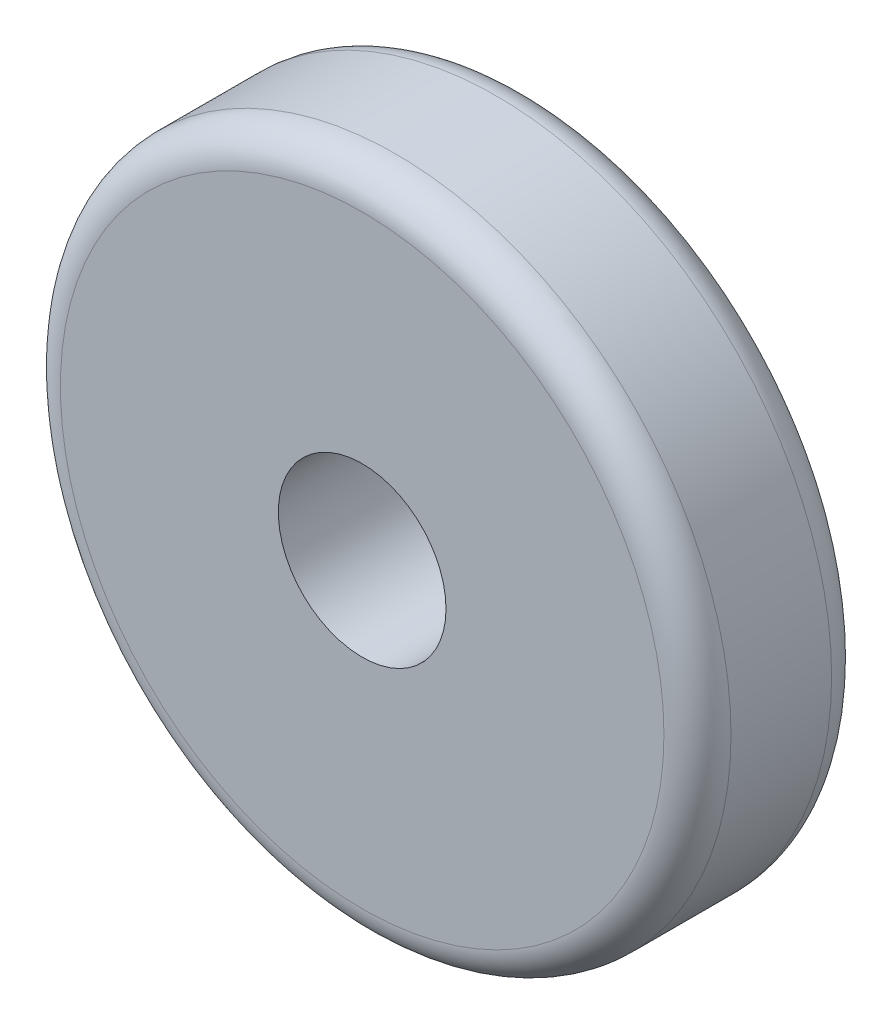
ISO-10303-21;
HEADER;
FILE_DESCRIPTION(('STEP AP214'),'2;1');
FILE_NAME('part.step','',(''),(''),'','','');
FILE_SCHEMA(('AUTOMOTIVE_DESIGN { 1 0 10303 214 1 1 1 1 }'));
ENDSEC;
DATA;
#1=APPLICATION_CONTEXT('core data for automotive mechanical design processes');
#2=APPLICATION_PROTOCOL_DEFINITION('international standard','automotive_design',2000,#1);
#3=PRODUCT_CONTEXT('',#1,'mechanical');
#4=PRODUCT('Part','Part','',(#3));
#5=PRODUCT_RELATED_PRODUCT_CATEGORY('part','',(#4));
#6=PRODUCT_DEFINITION_FORMATION('','',#4);
#7=PRODUCT_DEFINITION_CONTEXT('part definition',#1,'design');
#8=PRODUCT_DEFINITION('design','',#6,#7);
#9=PRODUCT_DEFINITION_SHAPE('','',#8);
#10=(LENGTH_UNIT() NAMED_UNIT(*) SI_UNIT(.MILLI.,.METRE.));
#11=(NAMED_UNIT(*) PLANE_ANGLE_UNIT() SI_UNIT($,.RADIAN.));
#12=(NAMED_UNIT(*) SI_UNIT($,.STERADIAN.) SOLID_ANGLE_UNIT());
#13=UNCERTAINTY_MEASURE_WITH_UNIT(LENGTH_MEASURE(1.E-05),#10,'distance_accuracy_value','');
#14=(GEOMETRIC_REPRESENTATION_CONTEXT(3) GLOBAL_UNCERTAINTY_ASSIGNED_CONTEXT((#13)) GLOBAL_UNIT_ASSIGNED_CONTEXT((#10,
#11,#12)) REPRESENTATION_CONTEXT('',''));
#15=CARTESIAN_POINT('',(0.,0.,0.));
#16=DIRECTION('',(0.,0.,1.));
#17=DIRECTION('',(1.,0.,0.));
#18=AXIS2_PLACEMENT_3D('',#15,#16,#17);
#19=CARTESIAN_POINT('',(0.,0.,5.));
#20=DIRECTION('',(0.,0.,-1.));
#21=DIRECTION('',(-1.,0.,0.));
#22=AXIS2_PLACEMENT_3D('',#19,#20,#21);
#23=CYLINDRICAL_SURFACE('',#22,20.);
#24=CARTESIAN_POINT('',(0.,0.,-3.));
#25=DIRECTION('',(0.,0.,1.));
#26=DIRECTION('',(1.,0.,0.));
#27=AXIS2_PLACEMENT_3D('',#24,#25,#26);
#28=CIRCLE('',#27,20.);
#29=CARTESIAN_POINT('',(20.,0.,-3.));
#30=VERTEX_POINT('',#29);
#31=EDGE_CURVE('E50',#30,#30,#28,.T.);
#32=ORIENTED_EDGE('',*,*,#31,.T.);
#33=EDGE_LOOP('',(#32));
#34=FACE_BOUND('',#33,.T.);
#35=CARTESIAN_POINT('',(0.,0.,3.));
#36=DIRECTION('',(0.,0.,1.));
#37=DIRECTION('',(1.,0.,0.));
#38=AXIS2_PLACEMENT_3D('',#35,#36,#37);
#39=CIRCLE('',#38,20.);
#40=CARTESIAN_POINT('',(20.,0.,3.));
#41=VERTEX_POINT('',#40);
#42=EDGE_CURVE('E55',#41,#41,#39,.F.);
#43=ORIENTED_EDGE('',*,*,#42,.T.);
#44=EDGE_LOOP('',(#43));
#45=FACE_BOUND('',#44,.T.);
#46=ADVANCED_FACE('F37',(#34,#45),#23,.T.);
#47=CARTESIAN_POINT('',(0.,0.,5.));
#48=DIRECTION('',(0.,0.,1.));
#49=DIRECTION('',(1.,0.,0.));
#50=AXIS2_PLACEMENT_3D('',#47,#48,#49);
#51=PLANE('',#50);
#52=CARTESIAN_POINT('',(0.,0.,5.));
#53=DIRECTION('',(0.,0.,1.));
#54=DIRECTION('',(1.,0.,0.));
#55=AXIS2_PLACEMENT_3D('',#52,#53,#54);
#56=CIRCLE('',#55,18.);
#57=CARTESIAN_POINT('',(18.,0.,5.));
#58=VERTEX_POINT('',#57);
#59=EDGE_CURVE('E10',#58,#58,#56,.T.);
#60=ORIENTED_EDGE('',*,*,#59,.T.);
#61=EDGE_LOOP('',(#60));
#62=FACE_BOUND('',#61,.T.);
#63=CARTESIAN_POINT('',(0.,0.,5.));
#64=DIRECTION('',(0.,0.,1.));
#65=DIRECTION('',(1.,0.,0.));
#66=AXIS2_PLACEMENT_3D('',#63,#64,#65);
#67=CIRCLE('',#66,5.);
#68=CARTESIAN_POINT('',(5.,0.,5.));
#69=VERTEX_POINT('',#68);
#70=EDGE_CURVE('E62',#69,#69,#67,.T.);
#71=ORIENTED_EDGE('',*,*,#70,.F.);
#72=EDGE_LOOP('',(#71));
#73=FACE_BOUND('',#72,.T.);
#74=ADVANCED_FACE('F79',(#62,#73),#51,.T.);
#75=CARTESIAN_POINT('',(0.,0.,-5.));
#76=DIRECTION('',(0.,0.,1.));
#77=DIRECTION('',(1.,0.,0.));
#78=AXIS2_PLACEMENT_3D('',#75,#76,#77);
#79=PLANE('',#78);
#80=CARTESIAN_POINT('',(0.,0.,-5.));
#81=DIRECTION('',(0.,0.,1.));
#82=DIRECTION('',(1.,0.,0.));
#83=AXIS2_PLACEMENT_3D('',#80,#81,#82);
#84=CIRCLE('',#83,18.);
#85=CARTESIAN_POINT('',(18.,0.,-5.));
#86=VERTEX_POINT('',#85);
#87=EDGE_CURVE('E45',#86,#86,#84,.F.);
#88=ORIENTED_EDGE('',*,*,#87,.T.);
#89=EDGE_LOOP('',(#88));
#90=FACE_BOUND('',#89,.T.);
#91=CARTESIAN_POINT('',(0.,0.,-5.));
#92=DIRECTION('',(0.,0.,1.));
#93=DIRECTION('',(1.,0.,0.));
#94=AXIS2_PLACEMENT_3D('',#91,#92,#93);
#95=CIRCLE('',#94,5.);
#96=CARTESIAN_POINT('',(5.,0.,-5.));
#97=VERTEX_POINT('',#96);
#98=EDGE_CURVE('E61',#97,#97,#95,.T.);
#99=ORIENTED_EDGE('',*,*,#98,.T.);
#100=EDGE_LOOP('',(#99));
#101=FACE_BOUND('',#100,.T.);
#102=ADVANCED_FACE('F70',(#90,#101),#79,.F.);
#103=CARTESIAN_POINT('',(0.,0.,-5.));
#104=DIRECTION('',(0.,0.,1.));
#105=DIRECTION('',(1.,0.,0.));
#106=AXIS2_PLACEMENT_3D('',#103,#104,#105);
#107=CYLINDRICAL_SURFACE('',#106,5.);
#108=ORIENTED_EDGE('',*,*,#98,.F.);
#109=EDGE_LOOP('',(#108));
#110=FACE_BOUND('',#109,.T.);
#111=ORIENTED_EDGE('',*,*,#70,.T.);
#112=EDGE_LOOP('',(#111));
#113=FACE_BOUND('',#112,.T.);
#114=ADVANCED_FACE('F72',(#110,#113),#107,.F.);
#115=CARTESIAN_POINT('',(0.,0.,-3.));
#116=DIRECTION('',(0.,0.,1.));
#117=DIRECTION('',(1.,0.,0.));
#118=AXIS2_PLACEMENT_3D('',#115,#116,#117);
#119=TOROIDAL_SURFACE('',#118,18.,2.);
#120=ORIENTED_EDGE('',*,*,#87,.F.);
#121=EDGE_LOOP('',(#120));
#122=FACE_BOUND('',#121,.T.);
#123=ORIENTED_EDGE('',*,*,#31,.F.);
#124=EDGE_LOOP('',(#123));
#125=FACE_BOUND('',#124,.T.);
#126=ADVANCED_FACE('F75',(#122,#125),#119,.T.);
#127=CARTESIAN_POINT('',(0.,0.,3.));
#128=DIRECTION('',(0.,0.,1.));
#129=DIRECTION('',(1.,0.,0.));
#130=AXIS2_PLACEMENT_3D('',#127,#128,#129);
#131=TOROIDAL_SURFACE('',#130,18.,2.);
#132=ORIENTED_EDGE('',*,*,#42,.F.);
#133=EDGE_LOOP('',(#132));
#134=FACE_BOUND('',#133,.T.);
#135=ORIENTED_EDGE('',*,*,#59,.F.);
#136=EDGE_LOOP('',(#135));
#137=FACE_BOUND('',#136,.T.);
#138=ADVANCED_FACE('F39',(#134,#137),#131,.T.);
#139=CLOSED_SHELL('',(#46,#74,#102,#114,#126,#138));
#140=MANIFOLD_SOLID_BREP('B2',#139);
#141=ADVANCED_BREP_SHAPE_REPRESENTATION('',(#18,#140),#14);
#142=SHAPE_DEFINITION_REPRESENTATION(#9,#141);
ENDSEC;
END-ISO-10303-21;
